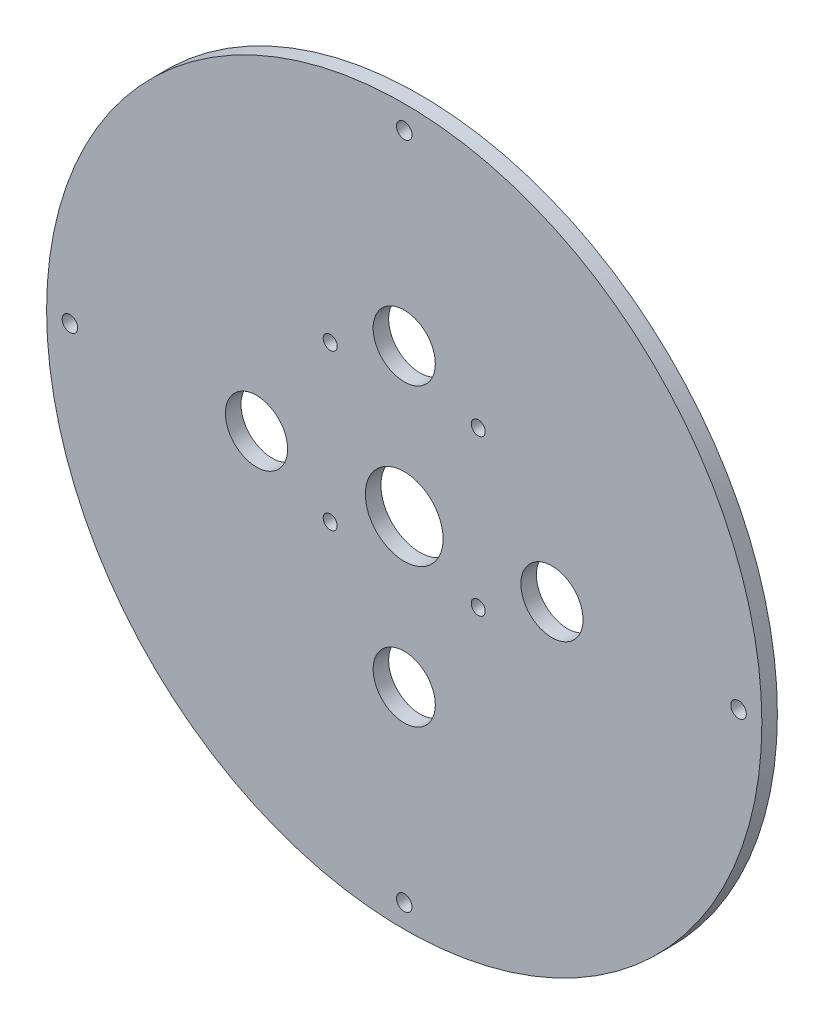
ISO-10303-21;
HEADER;
FILE_DESCRIPTION(('STEP AP214'),'2;1');
FILE_NAME('part.step','',(''),(''),'','','');
FILE_SCHEMA(('AUTOMOTIVE_DESIGN { 1 0 10303 214 1 1 1 1 }'));
ENDSEC;
DATA;
#1=APPLICATION_CONTEXT('core data for automotive mechanical design processes');
#2=APPLICATION_PROTOCOL_DEFINITION('international standard','automotive_design',2000,#1);
#3=PRODUCT_CONTEXT('',#1,'mechanical');
#4=PRODUCT('Part','Part','',(#3));
#5=PRODUCT_RELATED_PRODUCT_CATEGORY('part','',(#4));
#6=PRODUCT_DEFINITION_FORMATION('','',#4);
#7=PRODUCT_DEFINITION_CONTEXT('part definition',#1,'design');
#8=PRODUCT_DEFINITION('design','',#6,#7);
#9=PRODUCT_DEFINITION_SHAPE('','',#8);
#10=(LENGTH_UNIT() NAMED_UNIT(*) SI_UNIT(.MILLI.,.METRE.));
#11=(NAMED_UNIT(*) PLANE_ANGLE_UNIT() SI_UNIT($,.RADIAN.));
#12=(NAMED_UNIT(*) SI_UNIT($,.STERADIAN.) SOLID_ANGLE_UNIT());
#13=UNCERTAINTY_MEASURE_WITH_UNIT(LENGTH_MEASURE(1.E-05),#10,'distance_accuracy_value','');
#14=(GEOMETRIC_REPRESENTATION_CONTEXT(3) GLOBAL_UNCERTAINTY_ASSIGNED_CONTEXT((#13)) GLOBAL_UNIT_ASSIGNED_CONTEXT((#10,
#11,#12)) REPRESENTATION_CONTEXT('',''));
#15=CARTESIAN_POINT('',(0.,0.,0.));
#16=DIRECTION('',(0.,0.,1.));
#17=DIRECTION('',(1.,0.,0.));
#18=AXIS2_PLACEMENT_3D('',#15,#16,#17);
#19=CARTESIAN_POINT('',(0.,0.,6.35));
#20=DIRECTION('',(0.,0.,1.));
#21=DIRECTION('',(1.,0.,0.));
#22=AXIS2_PLACEMENT_3D('',#19,#20,#21);
#23=PLANE('',#22);
#24=CARTESIAN_POINT('',(3.41430387914653E-12,-60.325,6.35));
#25=DIRECTION('',(0.,0.,1.));
#26=DIRECTION('',(1.,0.,0.));
#27=AXIS2_PLACEMENT_3D('',#24,#25,#26);
#28=CIRCLE('',#27,12.7000000000037);
#29=CARTESIAN_POINT('',(12.7000000000071,-60.325,6.35));
#30=VERTEX_POINT('',#29);
#31=EDGE_CURVE('E111',#30,#30,#28,.T.);
#32=ORIENTED_EDGE('',*,*,#31,.F.);
#33=EDGE_LOOP('',(#32));
#34=FACE_BOUND('',#33,.T.);
#35=CARTESIAN_POINT('',(0.,60.325,6.35));
#36=DIRECTION('',(0.,0.,1.));
#37=DIRECTION('',(1.,0.,0.));
#38=AXIS2_PLACEMENT_3D('',#35,#36,#37);
#39=CIRCLE('',#38,12.7);
#40=CARTESIAN_POINT('',(12.7,60.325,6.35));
#41=VERTEX_POINT('',#40);
#42=EDGE_CURVE('E99',#41,#41,#39,.T.);
#43=ORIENTED_EDGE('',*,*,#42,.F.);
#44=EDGE_LOOP('',(#43));
#45=FACE_BOUND('',#44,.T.);
#46=CARTESIAN_POINT('',(-30.226,-17.018,6.35));
#47=DIRECTION('',(0.,0.,1.));
#48=DIRECTION('',(-1.,0.,0.));
#49=AXIS2_PLACEMENT_3D('',#46,#47,#48);
#50=CIRCLE('',#49,2.8575);
#51=CARTESIAN_POINT('',(-33.0835,-17.018,6.35));
#52=VERTEX_POINT('',#51);
#53=EDGE_CURVE('E87',#52,#52,#50,.T.);
#54=ORIENTED_EDGE('',*,*,#53,.F.);
#55=EDGE_LOOP('',(#54));
#56=FACE_BOUND('',#55,.T.);
#57=CARTESIAN_POINT('',(30.226,46.482,6.35));
#58=DIRECTION('',(0.,0.,1.));
#59=DIRECTION('',(-1.,0.,0.));
#60=AXIS2_PLACEMENT_3D('',#57,#58,#59);
#61=CIRCLE('',#60,2.8575);
#62=CARTESIAN_POINT('',(27.3685,46.482,6.35));
#63=VERTEX_POINT('',#62);
#64=EDGE_CURVE('E75',#63,#63,#61,.T.);
#65=ORIENTED_EDGE('',*,*,#64,.F.);
#66=EDGE_LOOP('',(#65));
#67=FACE_BOUND('',#66,.T.);
#68=CARTESIAN_POINT('',(-136.524999999999,-1.24931060852046E-12,6.35));
#69=DIRECTION('',(0.,0.,1.));
#70=DIRECTION('',(1.,0.,0.));
#71=AXIS2_PLACEMENT_3D('',#68,#69,#70);
#72=CIRCLE('',#71,3.175);
#73=CARTESIAN_POINT('',(-133.349999999999,-1.24931060852046E-12,6.35));
#74=VERTEX_POINT('',#73);
#75=EDGE_CURVE('E63',#74,#74,#72,.T.);
#76=ORIENTED_EDGE('',*,*,#75,.F.);
#77=EDGE_LOOP('',(#76));
#78=FACE_BOUND('',#77,.T.);
#79=CARTESIAN_POINT('',(136.525000000001,1.2325911180951E-12,6.35));
#80=DIRECTION('',(0.,0.,1.));
#81=DIRECTION('',(1.,0.,0.));
#82=AXIS2_PLACEMENT_3D('',#79,#80,#81);
#83=CIRCLE('',#82,3.175);
#84=CARTESIAN_POINT('',(139.700000000001,1.2325911180951E-12,6.35));
#85=VERTEX_POINT('',#84);
#86=EDGE_CURVE('E51',#85,#85,#83,.T.);
#87=ORIENTED_EDGE('',*,*,#86,.F.);
#88=EDGE_LOOP('',(#87));
#89=FACE_BOUND('',#88,.T.);
#90=CARTESIAN_POINT('',(0.,0.,6.35));
#91=DIRECTION('',(0.,0.,1.));
#92=DIRECTION('',(1.,0.,0.));
#93=AXIS2_PLACEMENT_3D('',#90,#91,#92);
#94=CIRCLE('',#93,146.05);
#95=CARTESIAN_POINT('',(146.05,0.,6.35));
#96=VERTEX_POINT('',#95);
#97=EDGE_CURVE('E10',#96,#96,#94,.T.);
#98=ORIENTED_EDGE('',*,*,#97,.T.);
#99=EDGE_LOOP('',(#98));
#100=FACE_BOUND('',#99,.T.);
#101=CARTESIAN_POINT('',(0.,136.525,6.35));
#102=DIRECTION('',(0.,0.,1.));
#103=DIRECTION('',(1.,0.,0.));
#104=AXIS2_PLACEMENT_3D('',#101,#102,#103);
#105=CIRCLE('',#104,3.175);
#106=CARTESIAN_POINT('',(3.175,136.525,6.35));
#107=VERTEX_POINT('',#106);
#108=EDGE_CURVE('E46',#107,#107,#105,.T.);
#109=ORIENTED_EDGE('',*,*,#108,.F.);
#110=EDGE_LOOP('',(#109));
#111=FACE_BOUND('',#110,.T.);
#112=CARTESIAN_POINT('',(2.4651822361902E-12,-136.525,6.35));
#113=DIRECTION('',(0.,0.,1.));
#114=DIRECTION('',(1.,0.,0.));
#115=AXIS2_PLACEMENT_3D('',#112,#113,#114);
#116=CIRCLE('',#115,3.175);
#117=CARTESIAN_POINT('',(3.17500000000246,-136.525,6.35));
#118=VERTEX_POINT('',#117);
#119=EDGE_CURVE('E57',#118,#118,#116,.T.);
#120=ORIENTED_EDGE('',*,*,#119,.F.);
#121=EDGE_LOOP('',(#120));
#122=FACE_BOUND('',#121,.T.);
#123=CARTESIAN_POINT('',(-30.226,46.482,6.35));
#124=DIRECTION('',(0.,0.,1.));
#125=DIRECTION('',(1.,0.,0.));
#126=AXIS2_PLACEMENT_3D('',#123,#124,#125);
#127=CIRCLE('',#126,2.8575);
#128=CARTESIAN_POINT('',(-27.3685,46.482,6.35));
#129=VERTEX_POINT('',#128);
#130=EDGE_CURVE('E69',#129,#129,#127,.T.);
#131=ORIENTED_EDGE('',*,*,#130,.F.);
#132=EDGE_LOOP('',(#131));
#133=FACE_BOUND('',#132,.T.);
#134=CARTESIAN_POINT('',(30.226,-17.018,6.35));
#135=DIRECTION('',(0.,0.,1.));
#136=DIRECTION('',(1.,0.,0.));
#137=AXIS2_PLACEMENT_3D('',#134,#135,#136);
#138=CIRCLE('',#137,2.8575);
#139=CARTESIAN_POINT('',(33.0835,-17.018,6.35));
#140=VERTEX_POINT('',#139);
#141=EDGE_CURVE('E81',#140,#140,#138,.T.);
#142=ORIENTED_EDGE('',*,*,#141,.F.);
#143=EDGE_LOOP('',(#142));
#144=FACE_BOUND('',#143,.T.);
#145=CARTESIAN_POINT('',(0.,0.,6.35));
#146=DIRECTION('',(0.,0.,1.));
#147=DIRECTION('',(1.,0.,0.));
#148=AXIS2_PLACEMENT_3D('',#145,#146,#147);
#149=CIRCLE('',#148,15.875);
#150=CARTESIAN_POINT('',(15.875,0.,6.35));
#151=VERTEX_POINT('',#150);
#152=EDGE_CURVE('E93',#151,#151,#149,.T.);
#153=ORIENTED_EDGE('',*,*,#152,.F.);
#154=EDGE_LOOP('',(#153));
#155=FACE_BOUND('',#154,.T.);
#156=CARTESIAN_POINT('',(60.3250000000017,1.70715193957327E-12,6.35));
#157=DIRECTION('',(0.,0.,1.));
#158=DIRECTION('',(1.,0.,0.));
#159=AXIS2_PLACEMENT_3D('',#156,#157,#158);
#160=CIRCLE('',#159,12.7000000000013);
#161=CARTESIAN_POINT('',(73.025000000003,1.70715193957327E-12,6.35));
#162=VERTEX_POINT('',#161);
#163=EDGE_CURVE('E105',#162,#162,#160,.T.);
#164=ORIENTED_EDGE('',*,*,#163,.F.);
#165=EDGE_LOOP('',(#164));
#166=FACE_BOUND('',#165,.T.);
#167=CARTESIAN_POINT('',(-60.3249999999983,-1.71453962138912E-12,6.35));
#168=DIRECTION('',(0.,0.,1.));
#169=DIRECTION('',(1.,0.,0.));
#170=AXIS2_PLACEMENT_3D('',#167,#168,#169);
#171=CIRCLE('',#170,12.7000000000027);
#172=CARTESIAN_POINT('',(-47.6249999999956,-1.71453962138912E-12,6.35));
#173=VERTEX_POINT('',#172);
#174=EDGE_CURVE('E117',#173,#173,#171,.T.);
#175=ORIENTED_EDGE('',*,*,#174,.F.);
#176=EDGE_LOOP('',(#175));
#177=FACE_BOUND('',#176,.T.);
#178=ADVANCED_FACE('F35',(#34,#45,#56,#67,#78,#89,#100,#111,#122,#133,#144,#155,#166,#177),#23,.T.);
#179=CARTESIAN_POINT('',(0.,0.,0.));
#180=DIRECTION('',(0.,0.,1.));
#181=DIRECTION('',(1.,0.,0.));
#182=AXIS2_PLACEMENT_3D('',#179,#180,#181);
#183=PLANE('',#182);
#184=CARTESIAN_POINT('',(0.,0.,0.));
#185=DIRECTION('',(0.,0.,1.));
#186=DIRECTION('',(1.,0.,0.));
#187=AXIS2_PLACEMENT_3D('',#184,#185,#186);
#188=CIRCLE('',#187,146.05);
#189=CARTESIAN_POINT('',(146.05,0.,0.));
#190=VERTEX_POINT('',#189);
#191=EDGE_CURVE('E39',#190,#190,#188,.T.);
#192=ORIENTED_EDGE('',*,*,#191,.F.);
#193=EDGE_LOOP('',(#192));
#194=FACE_BOUND('',#193,.T.);
#195=CARTESIAN_POINT('',(0.,136.525,0.));
#196=DIRECTION('',(0.,0.,1.));
#197=DIRECTION('',(1.,0.,0.));
#198=AXIS2_PLACEMENT_3D('',#195,#196,#197);
#199=CIRCLE('',#198,3.175);
#200=CARTESIAN_POINT('',(3.175,136.525,0.));
#201=VERTEX_POINT('',#200);
#202=EDGE_CURVE('E48',#201,#201,#199,.T.);
#203=ORIENTED_EDGE('',*,*,#202,.T.);
#204=EDGE_LOOP('',(#203));
#205=FACE_BOUND('',#204,.T.);
#206=CARTESIAN_POINT('',(136.525000000001,1.2325911180951E-12,0.));
#207=DIRECTION('',(0.,0.,1.));
#208=DIRECTION('',(1.,0.,0.));
#209=AXIS2_PLACEMENT_3D('',#206,#207,#208);
#210=CIRCLE('',#209,3.175);
#211=CARTESIAN_POINT('',(139.700000000001,1.2325911180951E-12,0.));
#212=VERTEX_POINT('',#211);
#213=EDGE_CURVE('E54',#212,#212,#210,.T.);
#214=ORIENTED_EDGE('',*,*,#213,.T.);
#215=EDGE_LOOP('',(#214));
#216=FACE_BOUND('',#215,.T.);
#217=CARTESIAN_POINT('',(2.4651822361902E-12,-136.525,0.));
#218=DIRECTION('',(0.,0.,1.));
#219=DIRECTION('',(1.,0.,0.));
#220=AXIS2_PLACEMENT_3D('',#217,#218,#219);
#221=CIRCLE('',#220,3.175);
#222=CARTESIAN_POINT('',(3.17500000000246,-136.525,0.));
#223=VERTEX_POINT('',#222);
#224=EDGE_CURVE('E60',#223,#223,#221,.T.);
#225=ORIENTED_EDGE('',*,*,#224,.T.);
#226=EDGE_LOOP('',(#225));
#227=FACE_BOUND('',#226,.T.);
#228=CARTESIAN_POINT('',(-136.524999999999,-1.24931060852046E-12,0.));
#229=DIRECTION('',(0.,0.,1.));
#230=DIRECTION('',(1.,0.,0.));
#231=AXIS2_PLACEMENT_3D('',#228,#229,#230);
#232=CIRCLE('',#231,3.175);
#233=CARTESIAN_POINT('',(-133.349999999999,-1.24931060852046E-12,0.));
#234=VERTEX_POINT('',#233);
#235=EDGE_CURVE('E66',#234,#234,#232,.T.);
#236=ORIENTED_EDGE('',*,*,#235,.T.);
#237=EDGE_LOOP('',(#236));
#238=FACE_BOUND('',#237,.T.);
#239=CARTESIAN_POINT('',(-30.226,46.482,0.));
#240=DIRECTION('',(0.,0.,1.));
#241=DIRECTION('',(1.,0.,0.));
#242=AXIS2_PLACEMENT_3D('',#239,#240,#241);
#243=CIRCLE('',#242,2.8575);
#244=CARTESIAN_POINT('',(-27.3685,46.482,0.));
#245=VERTEX_POINT('',#244);
#246=EDGE_CURVE('E72',#245,#245,#243,.T.);
#247=ORIENTED_EDGE('',*,*,#246,.T.);
#248=EDGE_LOOP('',(#247));
#249=FACE_BOUND('',#248,.T.);
#250=CARTESIAN_POINT('',(30.226,46.482,0.));
#251=DIRECTION('',(0.,0.,1.));
#252=DIRECTION('',(-1.,0.,0.));
#253=AXIS2_PLACEMENT_3D('',#250,#251,#252);
#254=CIRCLE('',#253,2.8575);
#255=CARTESIAN_POINT('',(27.3685,46.482,0.));
#256=VERTEX_POINT('',#255);
#257=EDGE_CURVE('E78',#256,#256,#254,.T.);
#258=ORIENTED_EDGE('',*,*,#257,.T.);
#259=EDGE_LOOP('',(#258));
#260=FACE_BOUND('',#259,.T.);
#261=CARTESIAN_POINT('',(30.226,-17.018,0.));
#262=DIRECTION('',(0.,0.,1.));
#263=DIRECTION('',(1.,0.,0.));
#264=AXIS2_PLACEMENT_3D('',#261,#262,#263);
#265=CIRCLE('',#264,2.8575);
#266=CARTESIAN_POINT('',(33.0835,-17.018,0.));
#267=VERTEX_POINT('',#266);
#268=EDGE_CURVE('E84',#267,#267,#265,.T.);
#269=ORIENTED_EDGE('',*,*,#268,.T.);
#270=EDGE_LOOP('',(#269));
#271=FACE_BOUND('',#270,.T.);
#272=CARTESIAN_POINT('',(-30.226,-17.018,0.));
#273=DIRECTION('',(0.,0.,1.));
#274=DIRECTION('',(-1.,0.,0.));
#275=AXIS2_PLACEMENT_3D('',#272,#273,#274);
#276=CIRCLE('',#275,2.8575);
#277=CARTESIAN_POINT('',(-33.0835,-17.018,0.));
#278=VERTEX_POINT('',#277);
#279=EDGE_CURVE('E90',#278,#278,#276,.T.);
#280=ORIENTED_EDGE('',*,*,#279,.T.);
#281=EDGE_LOOP('',(#280));
#282=FACE_BOUND('',#281,.T.);
#283=CARTESIAN_POINT('',(0.,0.,0.));
#284=DIRECTION('',(0.,0.,1.));
#285=DIRECTION('',(1.,0.,0.));
#286=AXIS2_PLACEMENT_3D('',#283,#284,#285);
#287=CIRCLE('',#286,15.875);
#288=CARTESIAN_POINT('',(15.875,0.,0.));
#289=VERTEX_POINT('',#288);
#290=EDGE_CURVE('E96',#289,#289,#287,.T.);
#291=ORIENTED_EDGE('',*,*,#290,.T.);
#292=EDGE_LOOP('',(#291));
#293=FACE_BOUND('',#292,.T.);
#294=CARTESIAN_POINT('',(0.,60.325,0.));
#295=DIRECTION('',(0.,0.,1.));
#296=DIRECTION('',(1.,0.,0.));
#297=AXIS2_PLACEMENT_3D('',#294,#295,#296);
#298=CIRCLE('',#297,12.7);
#299=CARTESIAN_POINT('',(12.7,60.325,0.));
#300=VERTEX_POINT('',#299);
#301=EDGE_CURVE('E102',#300,#300,#298,.T.);
#302=ORIENTED_EDGE('',*,*,#301,.T.);
#303=EDGE_LOOP('',(#302));
#304=FACE_BOUND('',#303,.T.);
#305=CARTESIAN_POINT('',(60.3250000000017,1.70715193957327E-12,0.));
#306=DIRECTION('',(0.,0.,1.));
#307=DIRECTION('',(1.,0.,0.));
#308=AXIS2_PLACEMENT_3D('',#305,#306,#307);
#309=CIRCLE('',#308,12.7000000000013);
#310=CARTESIAN_POINT('',(73.025000000003,1.70715193957327E-12,0.));
#311=VERTEX_POINT('',#310);
#312=EDGE_CURVE('E108',#311,#311,#309,.T.);
#313=ORIENTED_EDGE('',*,*,#312,.T.);
#314=EDGE_LOOP('',(#313));
#315=FACE_BOUND('',#314,.T.);
#316=CARTESIAN_POINT('',(3.41430387914653E-12,-60.325,0.));
#317=DIRECTION('',(0.,0.,1.));
#318=DIRECTION('',(1.,0.,0.));
#319=AXIS2_PLACEMENT_3D('',#316,#317,#318);
#320=CIRCLE('',#319,12.7000000000037);
#321=CARTESIAN_POINT('',(12.7000000000071,-60.325,0.));
#322=VERTEX_POINT('',#321);
#323=EDGE_CURVE('E114',#322,#322,#320,.T.);
#324=ORIENTED_EDGE('',*,*,#323,.T.);
#325=EDGE_LOOP('',(#324));
#326=FACE_BOUND('',#325,.T.);
#327=CARTESIAN_POINT('',(-60.3249999999983,-1.71453962138912E-12,0.));
#328=DIRECTION('',(0.,0.,1.));
#329=DIRECTION('',(1.,0.,0.));
#330=AXIS2_PLACEMENT_3D('',#327,#328,#329);
#331=CIRCLE('',#330,12.7000000000027);
#332=CARTESIAN_POINT('',(-47.6249999999956,-1.71453962138912E-12,0.));
#333=VERTEX_POINT('',#332);
#334=EDGE_CURVE('E120',#333,#333,#331,.T.);
#335=ORIENTED_EDGE('',*,*,#334,.T.);
#336=EDGE_LOOP('',(#335));
#337=FACE_BOUND('',#336,.T.);
#338=ADVANCED_FACE('F130',(#194,#205,#216,#227,#238,#249,#260,#271,#282,#293,#304,#315,#326,
#337),#183,.F.);
#339=CARTESIAN_POINT('',(0.,0.,6.35));
#340=DIRECTION('',(0.,0.,-1.));
#341=DIRECTION('',(-1.,0.,0.));
#342=AXIS2_PLACEMENT_3D('',#339,#340,#341);
#343=CYLINDRICAL_SURFACE('',#342,146.05);
#344=ORIENTED_EDGE('',*,*,#97,.F.);
#345=EDGE_LOOP('',(#344));
#346=FACE_BOUND('',#345,.T.);
#347=ORIENTED_EDGE('',*,*,#191,.T.);
#348=EDGE_LOOP('',(#347));
#349=FACE_BOUND('',#348,.T.);
#350=ADVANCED_FACE('F37',(#346,#349),#343,.T.);
#351=CARTESIAN_POINT('',(0.,136.525,6.35));
#352=DIRECTION('',(0.,0.,-1.));
#353=DIRECTION('',(-1.,0.,0.));
#354=AXIS2_PLACEMENT_3D('',#351,#352,#353);
#355=CYLINDRICAL_SURFACE('',#354,3.175);
#356=ORIENTED_EDGE('',*,*,#108,.T.);
#357=EDGE_LOOP('',(#356));
#358=FACE_BOUND('',#357,.T.);
#359=ORIENTED_EDGE('',*,*,#202,.F.);
#360=EDGE_LOOP('',(#359));
#361=FACE_BOUND('',#360,.T.);
#362=ADVANCED_FACE('F140',(#358,#361),#355,.F.);
#363=CARTESIAN_POINT('',(136.525000000001,1.2325911180951E-12,6.35));
#364=DIRECTION('',(0.,0.,-1.));
#365=DIRECTION('',(-1.,0.,0.));
#366=AXIS2_PLACEMENT_3D('',#363,#364,#365);
#367=CYLINDRICAL_SURFACE('',#366,3.175);
#368=ORIENTED_EDGE('',*,*,#86,.T.);
#369=EDGE_LOOP('',(#368));
#370=FACE_BOUND('',#369,.T.);
#371=ORIENTED_EDGE('',*,*,#213,.F.);
#372=EDGE_LOOP('',(#371));
#373=FACE_BOUND('',#372,.T.);
#374=ADVANCED_FACE('F143',(#370,#373),#367,.F.);
#375=CARTESIAN_POINT('',(2.4651822361902E-12,-136.525,6.35));
#376=DIRECTION('',(0.,0.,-1.));
#377=DIRECTION('',(-1.,0.,0.));
#378=AXIS2_PLACEMENT_3D('',#375,#376,#377);
#379=CYLINDRICAL_SURFACE('',#378,3.175);
#380=ORIENTED_EDGE('',*,*,#119,.T.);
#381=EDGE_LOOP('',(#380));
#382=FACE_BOUND('',#381,.T.);
#383=ORIENTED_EDGE('',*,*,#224,.F.);
#384=EDGE_LOOP('',(#383));
#385=FACE_BOUND('',#384,.T.);
#386=ADVANCED_FACE('F147',(#382,#385),#379,.F.);
#387=CARTESIAN_POINT('',(-136.524999999999,-1.24931060852046E-12,6.35));
#388=DIRECTION('',(0.,0.,-1.));
#389=DIRECTION('',(-1.,0.,0.));
#390=AXIS2_PLACEMENT_3D('',#387,#388,#389);
#391=CYLINDRICAL_SURFACE('',#390,3.175);
#392=ORIENTED_EDGE('',*,*,#75,.T.);
#393=EDGE_LOOP('',(#392));
#394=FACE_BOUND('',#393,.T.);
#395=ORIENTED_EDGE('',*,*,#235,.F.);
#396=EDGE_LOOP('',(#395));
#397=FACE_BOUND('',#396,.T.);
#398=ADVANCED_FACE('F151',(#394,#397),#391,.F.);
#399=CARTESIAN_POINT('',(-30.226,46.482,6.35));
#400=DIRECTION('',(0.,0.,-1.));
#401=DIRECTION('',(-1.,0.,0.));
#402=AXIS2_PLACEMENT_3D('',#399,#400,#401);
#403=CYLINDRICAL_SURFACE('',#402,2.8575);
#404=ORIENTED_EDGE('',*,*,#130,.T.);
#405=EDGE_LOOP('',(#404));
#406=FACE_BOUND('',#405,.T.);
#407=ORIENTED_EDGE('',*,*,#246,.F.);
#408=EDGE_LOOP('',(#407));
#409=FACE_BOUND('',#408,.T.);
#410=ADVANCED_FACE('F155',(#406,#409),#403,.F.);
#411=CARTESIAN_POINT('',(30.226,46.482,6.35));
#412=DIRECTION('',(0.,0.,-1.));
#413=DIRECTION('',(-1.,0.,0.));
#414=AXIS2_PLACEMENT_3D('',#411,#412,#413);
#415=CYLINDRICAL_SURFACE('',#414,2.8575);
#416=ORIENTED_EDGE('',*,*,#64,.T.);
#417=EDGE_LOOP('',(#416));
#418=FACE_BOUND('',#417,.T.);
#419=ORIENTED_EDGE('',*,*,#257,.F.);
#420=EDGE_LOOP('',(#419));
#421=FACE_BOUND('',#420,.T.);
#422=ADVANCED_FACE('F159',(#418,#421),#415,.F.);
#423=CARTESIAN_POINT('',(30.226,-17.018,6.35));
#424=DIRECTION('',(0.,0.,-1.));
#425=DIRECTION('',(-1.,0.,0.));
#426=AXIS2_PLACEMENT_3D('',#423,#424,#425);
#427=CYLINDRICAL_SURFACE('',#426,2.8575);
#428=ORIENTED_EDGE('',*,*,#141,.T.);
#429=EDGE_LOOP('',(#428));
#430=FACE_BOUND('',#429,.T.);
#431=ORIENTED_EDGE('',*,*,#268,.F.);
#432=EDGE_LOOP('',(#431));
#433=FACE_BOUND('',#432,.T.);
#434=ADVANCED_FACE('F163',(#430,#433),#427,.F.);
#435=CARTESIAN_POINT('',(-30.226,-17.018,6.35));
#436=DIRECTION('',(0.,0.,-1.));
#437=DIRECTION('',(-1.,0.,0.));
#438=AXIS2_PLACEMENT_3D('',#435,#436,#437);
#439=CYLINDRICAL_SURFACE('',#438,2.8575);
#440=ORIENTED_EDGE('',*,*,#53,.T.);
#441=EDGE_LOOP('',(#440));
#442=FACE_BOUND('',#441,.T.);
#443=ORIENTED_EDGE('',*,*,#279,.F.);
#444=EDGE_LOOP('',(#443));
#445=FACE_BOUND('',#444,.T.);
#446=ADVANCED_FACE('F167',(#442,#445),#439,.F.);
#447=CARTESIAN_POINT('',(0.,0.,6.35));
#448=DIRECTION('',(0.,0.,-1.));
#449=DIRECTION('',(-1.,0.,0.));
#450=AXIS2_PLACEMENT_3D('',#447,#448,#449);
#451=CYLINDRICAL_SURFACE('',#450,15.875);
#452=ORIENTED_EDGE('',*,*,#152,.T.);
#453=EDGE_LOOP('',(#452));
#454=FACE_BOUND('',#453,.T.);
#455=ORIENTED_EDGE('',*,*,#290,.F.);
#456=EDGE_LOOP('',(#455));
#457=FACE_BOUND('',#456,.T.);
#458=ADVANCED_FACE('F171',(#454,#457),#451,.F.);
#459=CARTESIAN_POINT('',(0.,60.325,6.35));
#460=DIRECTION('',(0.,0.,-1.));
#461=DIRECTION('',(-1.,0.,0.));
#462=AXIS2_PLACEMENT_3D('',#459,#460,#461);
#463=CYLINDRICAL_SURFACE('',#462,12.7);
#464=ORIENTED_EDGE('',*,*,#42,.T.);
#465=EDGE_LOOP('',(#464));
#466=FACE_BOUND('',#465,.T.);
#467=ORIENTED_EDGE('',*,*,#301,.F.);
#468=EDGE_LOOP('',(#467));
#469=FACE_BOUND('',#468,.T.);
#470=ADVANCED_FACE('F175',(#466,#469),#463,.F.);
#471=CARTESIAN_POINT('',(60.3250000000017,1.70715193957327E-12,6.35));
#472=DIRECTION('',(0.,0.,-1.));
#473=DIRECTION('',(-1.,0.,0.));
#474=AXIS2_PLACEMENT_3D('',#471,#472,#473);
#475=CYLINDRICAL_SURFACE('',#474,12.7000000000013);
#476=ORIENTED_EDGE('',*,*,#163,.T.);
#477=EDGE_LOOP('',(#476));
#478=FACE_BOUND('',#477,.T.);
#479=ORIENTED_EDGE('',*,*,#312,.F.);
#480=EDGE_LOOP('',(#479));
#481=FACE_BOUND('',#480,.T.);
#482=ADVANCED_FACE('F179',(#478,#481),#475,.F.);
#483=CARTESIAN_POINT('',(3.41430387914653E-12,-60.325,6.35));
#484=DIRECTION('',(0.,0.,-1.));
#485=DIRECTION('',(-1.,0.,0.));
#486=AXIS2_PLACEMENT_3D('',#483,#484,#485);
#487=CYLINDRICAL_SURFACE('',#486,12.7000000000037);
#488=ORIENTED_EDGE('',*,*,#31,.T.);
#489=EDGE_LOOP('',(#488));
#490=FACE_BOUND('',#489,.T.);
#491=ORIENTED_EDGE('',*,*,#323,.F.);
#492=EDGE_LOOP('',(#491));
#493=FACE_BOUND('',#492,.T.);
#494=ADVANCED_FACE('F183',(#490,#493),#487,.F.);
#495=CARTESIAN_POINT('',(-60.3249999999983,-1.71453962138912E-12,6.35));
#496=DIRECTION('',(0.,0.,-1.));
#497=DIRECTION('',(-1.,0.,0.));
#498=AXIS2_PLACEMENT_3D('',#495,#496,#497);
#499=CYLINDRICAL_SURFACE('',#498,12.7000000000027);
#500=ORIENTED_EDGE('',*,*,#174,.T.);
#501=EDGE_LOOP('',(#500));
#502=FACE_BOUND('',#501,.T.);
#503=ORIENTED_EDGE('',*,*,#334,.F.);
#504=EDGE_LOOP('',(#503));
#505=FACE_BOUND('',#504,.T.);
#506=ADVANCED_FACE('F126',(#502,#505),#499,.F.);
#507=CLOSED_SHELL('',(#178,#338,#350,#362,#374,#386,#398,#410,#422,#434,#446,#458,#470,#482,
#494,#506));
#508=MANIFOLD_SOLID_BREP('B2',#507);
#509=ADVANCED_BREP_SHAPE_REPRESENTATION('',(#18,#508),#14);
#510=SHAPE_DEFINITION_REPRESENTATION(#9,#509);
ENDSEC;
END-ISO-10303-21;
